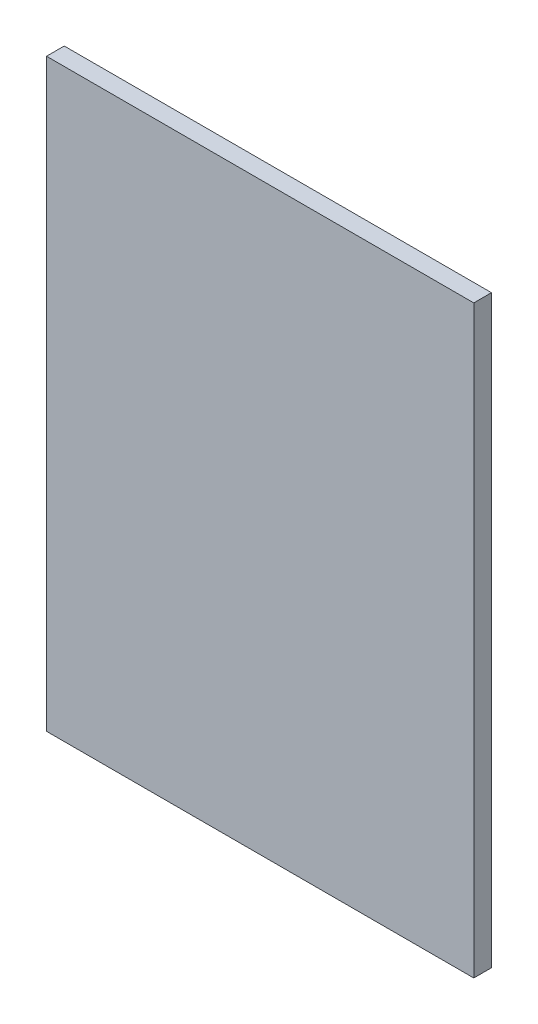
ISO-10303-21;
HEADER;
FILE_DESCRIPTION(('STEP AP214'),'2;1');
FILE_NAME('part.step','',(''),(''),'','','');
FILE_SCHEMA(('AUTOMOTIVE_DESIGN { 1 0 10303 214 1 1 1 1 }'));
ENDSEC;
DATA;
#1=APPLICATION_CONTEXT('core data for automotive mechanical design processes');
#2=APPLICATION_PROTOCOL_DEFINITION('international standard','automotive_design',2000,#1);
#3=PRODUCT_CONTEXT('',#1,'mechanical');
#4=PRODUCT('Part','Part','',(#3));
#5=PRODUCT_RELATED_PRODUCT_CATEGORY('part','',(#4));
#6=PRODUCT_DEFINITION_FORMATION('','',#4);
#7=PRODUCT_DEFINITION_CONTEXT('part definition',#1,'design');
#8=PRODUCT_DEFINITION('design','',#6,#7);
#9=PRODUCT_DEFINITION_SHAPE('','',#8);
#10=(LENGTH_UNIT() NAMED_UNIT(*) SI_UNIT(.MILLI.,.METRE.));
#11=(NAMED_UNIT(*) PLANE_ANGLE_UNIT() SI_UNIT($,.RADIAN.));
#12=(NAMED_UNIT(*) SI_UNIT($,.STERADIAN.) SOLID_ANGLE_UNIT());
#13=UNCERTAINTY_MEASURE_WITH_UNIT(LENGTH_MEASURE(1.E-05),#10,'distance_accuracy_value','');
#14=(GEOMETRIC_REPRESENTATION_CONTEXT(3) GLOBAL_UNCERTAINTY_ASSIGNED_CONTEXT((#13)) GLOBAL_UNIT_ASSIGNED_CONTEXT((#10,
#11,#12)) REPRESENTATION_CONTEXT('',''));
#15=CARTESIAN_POINT('',(0.,0.,0.));
#16=DIRECTION('',(0.,0.,1.));
#17=DIRECTION('',(1.,0.,0.));
#18=AXIS2_PLACEMENT_3D('',#15,#16,#17);
#19=CARTESIAN_POINT('',(0.,0.,0.1));
#20=DIRECTION('',(0.,0.,1.));
#21=DIRECTION('',(1.,0.,0.));
#22=AXIS2_PLACEMENT_3D('',#19,#20,#21);
#23=PLANE('',#22);
#24=DIRECTION('',(0.,1.,0.));
#25=VECTOR('',#24,1.);
#26=CARTESIAN_POINT('',(2.413,0.,0.1));
#27=LINE('',#26,#25);
#28=CARTESIAN_POINT('',(2.413,3.302,0.1));
#29=VERTEX_POINT('',#28);
#30=CARTESIAN_POINT('',(2.413,0.,0.1));
#31=VERTEX_POINT('',#30);
#32=EDGE_CURVE('E76',#29,#31,#27,.F.);
#33=ORIENTED_EDGE('',*,*,#32,.F.);
#34=DIRECTION('',(1.,0.,0.));
#35=VECTOR('',#34,1.);
#36=CARTESIAN_POINT('',(0.,3.302,0.1));
#37=LINE('',#36,#35);
#38=CARTESIAN_POINT('',(0.,3.302,0.1));
#39=VERTEX_POINT('',#38);
#40=EDGE_CURVE('E58',#39,#29,#37,.T.);
#41=ORIENTED_EDGE('',*,*,#40,.F.);
#42=DIRECTION('',(0.,1.,0.));
#43=VECTOR('',#42,1.);
#44=CARTESIAN_POINT('',(0.,0.,0.1));
#45=LINE('',#44,#43);
#46=CARTESIAN_POINT('',(0.,0.,0.1));
#47=VERTEX_POINT('',#46);
#48=EDGE_CURVE('E20',#39,#47,#45,.F.);
#49=ORIENTED_EDGE('',*,*,#48,.T.);
#50=DIRECTION('',(1.,0.,0.));
#51=VECTOR('',#50,1.);
#52=CARTESIAN_POINT('',(0.,0.,0.1));
#53=LINE('',#52,#51);
#54=EDGE_CURVE('E55',#47,#31,#53,.T.);
#55=ORIENTED_EDGE('',*,*,#54,.T.);
#56=EDGE_LOOP('',(#33,#41,#49,#55));
#57=FACE_BOUND('',#56,.T.);
#58=ADVANCED_FACE('F17',(#57),#23,.T.);
#59=CARTESIAN_POINT('',(0.,0.,0.));
#60=DIRECTION('',(1.,0.,0.));
#61=DIRECTION('',(0.,0.,-1.));
#62=AXIS2_PLACEMENT_3D('',#59,#60,#61);
#63=PLANE('',#62);
#64=DIRECTION('',(0.,0.,1.));
#65=VECTOR('',#64,1.);
#66=CARTESIAN_POINT('',(0.,3.302,0.));
#67=LINE('',#66,#65);
#68=CARTESIAN_POINT('',(0.,3.302,0.));
#69=VERTEX_POINT('',#68);
#70=EDGE_CURVE('E78',#69,#39,#67,.T.);
#71=ORIENTED_EDGE('',*,*,#70,.F.);
#72=DIRECTION('',(0.,1.,0.));
#73=VECTOR('',#72,1.);
#74=CARTESIAN_POINT('',(0.,0.,0.));
#75=LINE('',#74,#73);
#76=CARTESIAN_POINT('',(0.,0.,0.));
#77=VERTEX_POINT('',#76);
#78=EDGE_CURVE('E73',#69,#77,#75,.F.);
#79=ORIENTED_EDGE('',*,*,#78,.T.);
#80=DIRECTION('',(0.,0.,1.));
#81=VECTOR('',#80,1.);
#82=CARTESIAN_POINT('',(0.,0.,0.));
#83=LINE('',#82,#81);
#84=EDGE_CURVE('E63',#77,#47,#83,.T.);
#85=ORIENTED_EDGE('',*,*,#84,.T.);
#86=ORIENTED_EDGE('',*,*,#48,.F.);
#87=EDGE_LOOP('',(#71,#79,#85,#86));
#88=FACE_BOUND('',#87,.T.);
#89=ADVANCED_FACE('F72',(#88),#63,.F.);
#90=CARTESIAN_POINT('',(0.,0.,0.));
#91=DIRECTION('',(0.,1.,0.));
#92=DIRECTION('',(0.,0.,1.));
#93=AXIS2_PLACEMENT_3D('',#90,#91,#92);
#94=PLANE('',#93);
#95=ORIENTED_EDGE('',*,*,#54,.F.);
#96=ORIENTED_EDGE('',*,*,#84,.F.);
#97=DIRECTION('',(1.,0.,0.));
#98=VECTOR('',#97,1.);
#99=CARTESIAN_POINT('',(0.,0.,0.));
#100=LINE('',#99,#98);
#101=CARTESIAN_POINT('',(2.413,0.,0.));
#102=VERTEX_POINT('',#101);
#103=EDGE_CURVE('E83',#77,#102,#100,.T.);
#104=ORIENTED_EDGE('',*,*,#103,.T.);
#105=DIRECTION('',(0.,0.,-1.));
#106=VECTOR('',#105,1.);
#107=CARTESIAN_POINT('',(2.413,0.,0.));
#108=LINE('',#107,#106);
#109=EDGE_CURVE('E69',#31,#102,#108,.T.);
#110=ORIENTED_EDGE('',*,*,#109,.F.);
#111=EDGE_LOOP('',(#95,#96,#104,#110));
#112=FACE_BOUND('',#111,.T.);
#113=ADVANCED_FACE('F66',(#112),#94,.F.);
#114=CARTESIAN_POINT('',(2.413,0.,0.));
#115=DIRECTION('',(1.,0.,0.));
#116=DIRECTION('',(0.,0.,-1.));
#117=AXIS2_PLACEMENT_3D('',#114,#115,#116);
#118=PLANE('',#117);
#119=DIRECTION('',(0.,0.,1.));
#120=VECTOR('',#119,1.);
#121=CARTESIAN_POINT('',(2.413,3.302,0.));
#122=LINE('',#121,#120);
#123=CARTESIAN_POINT('',(2.413,3.302,0.));
#124=VERTEX_POINT('',#123);
#125=EDGE_CURVE('E34',#29,#124,#122,.F.);
#126=ORIENTED_EDGE('',*,*,#125,.F.);
#127=ORIENTED_EDGE('',*,*,#32,.T.);
#128=ORIENTED_EDGE('',*,*,#109,.T.);
#129=DIRECTION('',(0.,1.,0.));
#130=VECTOR('',#129,1.);
#131=CARTESIAN_POINT('',(2.413,0.,0.));
#132=LINE('',#131,#130);
#133=EDGE_CURVE('E26',#102,#124,#132,.T.);
#134=ORIENTED_EDGE('',*,*,#133,.T.);
#135=EDGE_LOOP('',(#126,#127,#128,#134));
#136=FACE_BOUND('',#135,.T.);
#137=ADVANCED_FACE('F88',(#136),#118,.T.);
#138=CARTESIAN_POINT('',(0.,3.302,0.));
#139=DIRECTION('',(0.,1.,0.));
#140=DIRECTION('',(0.,0.,1.));
#141=AXIS2_PLACEMENT_3D('',#138,#139,#140);
#142=PLANE('',#141);
#143=ORIENTED_EDGE('',*,*,#40,.T.);
#144=ORIENTED_EDGE('',*,*,#125,.T.);
#145=DIRECTION('',(1.,0.,0.));
#146=VECTOR('',#145,1.);
#147=CARTESIAN_POINT('',(0.,3.302,0.));
#148=LINE('',#147,#146);
#149=EDGE_CURVE('E11',#124,#69,#148,.F.);
#150=ORIENTED_EDGE('',*,*,#149,.T.);
#151=ORIENTED_EDGE('',*,*,#70,.T.);
#152=EDGE_LOOP('',(#143,#144,#150,#151));
#153=FACE_BOUND('',#152,.T.);
#154=ADVANCED_FACE('F91',(#153),#142,.T.);
#155=CARTESIAN_POINT('',(0.,0.,0.));
#156=DIRECTION('',(0.,0.,1.));
#157=DIRECTION('',(1.,0.,0.));
#158=AXIS2_PLACEMENT_3D('',#155,#156,#157);
#159=PLANE('',#158);
#160=ORIENTED_EDGE('',*,*,#133,.F.);
#161=ORIENTED_EDGE('',*,*,#103,.F.);
#162=ORIENTED_EDGE('',*,*,#78,.F.);
#163=ORIENTED_EDGE('',*,*,#149,.F.);
#164=EDGE_LOOP('',(#160,#161,#162,#163));
#165=FACE_BOUND('',#164,.T.);
#166=ADVANCED_FACE('F90',(#165),#159,.F.);
#167=CLOSED_SHELL('',(#58,#89,#113,#137,#154,#166));
#168=MANIFOLD_SOLID_BREP('B1',#167);
#169=ADVANCED_BREP_SHAPE_REPRESENTATION('',(#18,#168),#14);
#170=SHAPE_DEFINITION_REPRESENTATION(#9,#169);
ENDSEC;
END-ISO-10303-21;
